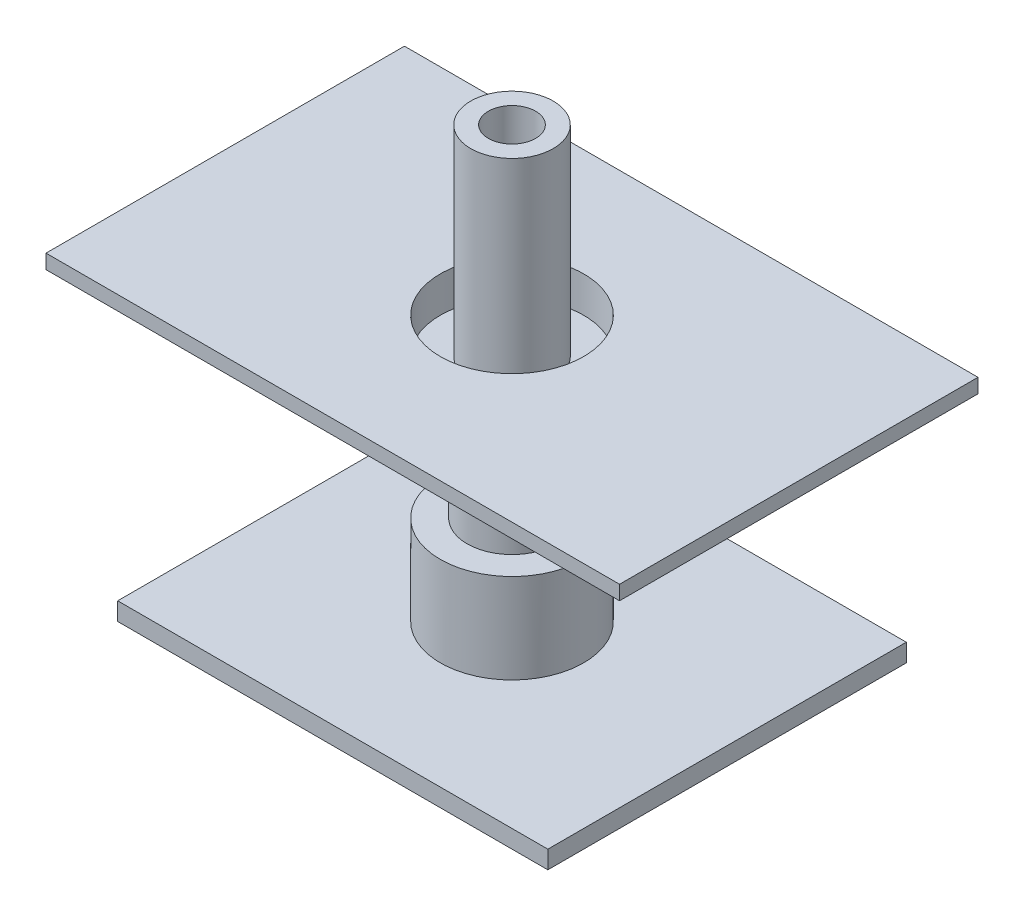
ISO-10303-21;
HEADER;
FILE_DESCRIPTION(('STEP AP214'),'2;1');
FILE_NAME('part.step','',(''),(''),'','','');
FILE_SCHEMA(('AUTOMOTIVE_DESIGN { 1 0 10303 214 1 1 1 1 }'));
ENDSEC;
DATA;
#1=APPLICATION_CONTEXT('core data for automotive mechanical design processes');
#2=APPLICATION_PROTOCOL_DEFINITION('international standard','automotive_design',2000,#1);
#3=PRODUCT_CONTEXT('',#1,'mechanical');
#4=PRODUCT('Part','Part','',(#3));
#5=PRODUCT_RELATED_PRODUCT_CATEGORY('part','',(#4));
#6=PRODUCT_DEFINITION_FORMATION('','',#4);
#7=PRODUCT_DEFINITION_CONTEXT('part definition',#1,'design');
#8=PRODUCT_DEFINITION('design','',#6,#7);
#9=PRODUCT_DEFINITION_SHAPE('','',#8);
#10=(LENGTH_UNIT() NAMED_UNIT(*) SI_UNIT(.MILLI.,.METRE.));
#11=(NAMED_UNIT(*) PLANE_ANGLE_UNIT() SI_UNIT($,.RADIAN.));
#12=(NAMED_UNIT(*) SI_UNIT($,.STERADIAN.) SOLID_ANGLE_UNIT());
#13=UNCERTAINTY_MEASURE_WITH_UNIT(LENGTH_MEASURE(1.E-05),#10,'distance_accuracy_value','');
#14=(GEOMETRIC_REPRESENTATION_CONTEXT(3) GLOBAL_UNCERTAINTY_ASSIGNED_CONTEXT((#13)) GLOBAL_UNIT_ASSIGNED_CONTEXT((#10,
#11,#12)) REPRESENTATION_CONTEXT('',''));
#15=CARTESIAN_POINT('',(0.,0.,0.));
#16=DIRECTION('',(0.,0.,1.));
#17=DIRECTION('',(1.,0.,0.));
#18=AXIS2_PLACEMENT_3D('',#15,#16,#17);
#19=CARTESIAN_POINT('',(0.,79.,0.));
#20=DIRECTION('',(0.,1.,0.));
#21=DIRECTION('',(0.,0.,1.));
#22=AXIS2_PLACEMENT_3D('',#19,#20,#21);
#23=PLANE('',#22);
#24=CARTESIAN_POINT('',(0.,79.,0.));
#25=DIRECTION('',(0.,1.,0.));
#26=DIRECTION('',(0.,0.,1.));
#27=AXIS2_PLACEMENT_3D('',#24,#25,#26);
#28=CIRCLE('',#27,20.);
#29=CARTESIAN_POINT('',(0.,79.,20.));
#30=VERTEX_POINT('',#29);
#31=EDGE_CURVE('E341',#30,#30,#28,.T.);
#32=ORIENTED_EDGE('',*,*,#31,.F.);
#33=EDGE_LOOP('',(#32));
#34=FACE_BOUND('',#33,.T.);
#35=DIRECTION('',(0.,0.,-1.));
#36=VECTOR('',#35,1.);
#37=CARTESIAN_POINT('',(80.,79.,50.));
#38=LINE('',#37,#36);
#39=CARTESIAN_POINT('',(80.,79.,50.));
#40=VERTEX_POINT('',#39);
#41=CARTESIAN_POINT('',(80.,79.,-50.));
#42=VERTEX_POINT('',#41);
#43=EDGE_CURVE('E99',#40,#42,#38,.T.);
#44=ORIENTED_EDGE('',*,*,#43,.T.);
#45=DIRECTION('',(-1.,0.,0.));
#46=VECTOR('',#45,1.);
#47=CARTESIAN_POINT('',(-80.,79.,-50.));
#48=LINE('',#47,#46);
#49=CARTESIAN_POINT('',(-80.,79.,-50.));
#50=VERTEX_POINT('',#49);
#51=EDGE_CURVE('E95',#42,#50,#48,.T.);
#52=ORIENTED_EDGE('',*,*,#51,.T.);
#53=DIRECTION('',(0.,0.,1.));
#54=VECTOR('',#53,1.);
#55=CARTESIAN_POINT('',(-80.,79.,50.));
#56=LINE('',#55,#54);
#57=CARTESIAN_POINT('',(-80.,79.,50.));
#58=VERTEX_POINT('',#57);
#59=EDGE_CURVE('E97',#50,#58,#56,.T.);
#60=ORIENTED_EDGE('',*,*,#59,.T.);
#61=DIRECTION('',(1.,0.,0.));
#62=VECTOR('',#61,1.);
#63=CARTESIAN_POINT('',(-80.,79.,50.));
#64=LINE('',#63,#62);
#65=EDGE_CURVE('E64',#58,#40,#64,.T.);
#66=ORIENTED_EDGE('',*,*,#65,.T.);
#67=EDGE_LOOP('',(#44,#52,#60,#66));
#68=FACE_BOUND('',#67,.T.);
#69=ADVANCED_FACE('F47',(#34,#68),#23,.T.);
#70=CARTESIAN_POINT('',(0.,75.,0.));
#71=DIRECTION('',(0.,-1.,0.));
#72=DIRECTION('',(0.,0.,-1.));
#73=AXIS2_PLACEMENT_3D('',#70,#71,#72);
#74=PLANE('',#73);
#75=CARTESIAN_POINT('',(0.,75.,0.));
#76=DIRECTION('',(0.,-1.,0.));
#77=DIRECTION('',(0.,0.,-1.));
#78=AXIS2_PLACEMENT_3D('',#75,#76,#77);
#79=CIRCLE('',#78,22.5);
#80=CARTESIAN_POINT('',(0.,75.,-22.5));
#81=VERTEX_POINT('',#80);
#82=EDGE_CURVE('E12',#81,#81,#79,.F.);
#83=ORIENTED_EDGE('',*,*,#82,.T.);
#84=EDGE_LOOP('',(#83));
#85=FACE_BOUND('',#84,.T.);
#86=DIRECTION('',(0.,0.,-1.));
#87=VECTOR('',#86,1.);
#88=CARTESIAN_POINT('',(80.,75.,50.));
#89=LINE('',#88,#87);
#90=CARTESIAN_POINT('',(80.,75.,50.));
#91=VERTEX_POINT('',#90);
#92=CARTESIAN_POINT('',(80.,75.,-50.));
#93=VERTEX_POINT('',#92);
#94=EDGE_CURVE('E114',#91,#93,#89,.T.);
#95=ORIENTED_EDGE('',*,*,#94,.F.);
#96=DIRECTION('',(1.,0.,0.));
#97=VECTOR('',#96,1.);
#98=CARTESIAN_POINT('',(-80.,75.,50.));
#99=LINE('',#98,#97);
#100=CARTESIAN_POINT('',(-80.,75.,50.));
#101=VERTEX_POINT('',#100);
#102=EDGE_CURVE('E87',#101,#91,#99,.T.);
#103=ORIENTED_EDGE('',*,*,#102,.F.);
#104=DIRECTION('',(0.,0.,1.));
#105=VECTOR('',#104,1.);
#106=CARTESIAN_POINT('',(-80.,75.,50.));
#107=LINE('',#106,#105);
#108=CARTESIAN_POINT('',(-80.,75.,-50.));
#109=VERTEX_POINT('',#108);
#110=EDGE_CURVE('E81',#109,#101,#107,.T.);
#111=ORIENTED_EDGE('',*,*,#110,.F.);
#112=DIRECTION('',(-1.,0.,0.));
#113=VECTOR('',#112,1.);
#114=CARTESIAN_POINT('',(-80.,75.,-50.));
#115=LINE('',#114,#113);
#116=EDGE_CURVE('E104',#93,#109,#115,.T.);
#117=ORIENTED_EDGE('',*,*,#116,.F.);
#118=EDGE_LOOP('',(#95,#103,#111,#117));
#119=FACE_BOUND('',#118,.T.);
#120=ADVANCED_FACE('F154',(#85,#119),#74,.T.);
#121=CARTESIAN_POINT('',(80.,79.,50.));
#122=DIRECTION('',(-1.,0.,0.));
#123=DIRECTION('',(0.,0.,1.));
#124=AXIS2_PLACEMENT_3D('',#121,#122,#123);
#125=PLANE('',#124);
#126=ORIENTED_EDGE('',*,*,#94,.T.);
#127=DIRECTION('',(0.,-1.,0.));
#128=VECTOR('',#127,1.);
#129=CARTESIAN_POINT('',(80.,79.,-50.));
#130=LINE('',#129,#128);
#131=EDGE_CURVE('E105',#42,#93,#130,.T.);
#132=ORIENTED_EDGE('',*,*,#131,.F.);
#133=ORIENTED_EDGE('',*,*,#43,.F.);
#134=DIRECTION('',(0.,-1.,0.));
#135=VECTOR('',#134,1.);
#136=CARTESIAN_POINT('',(80.,79.,50.));
#137=LINE('',#136,#135);
#138=EDGE_CURVE('E110',#40,#91,#137,.T.);
#139=ORIENTED_EDGE('',*,*,#138,.T.);
#140=EDGE_LOOP('',(#126,#132,#133,#139));
#141=FACE_BOUND('',#140,.T.);
#142=ADVANCED_FACE('F160',(#141),#125,.F.);
#143=CARTESIAN_POINT('',(-80.,79.,-50.));
#144=DIRECTION('',(0.,0.,1.));
#145=DIRECTION('',(1.,0.,0.));
#146=AXIS2_PLACEMENT_3D('',#143,#144,#145);
#147=PLANE('',#146);
#148=ORIENTED_EDGE('',*,*,#116,.T.);
#149=DIRECTION('',(0.,-1.,0.));
#150=VECTOR('',#149,1.);
#151=CARTESIAN_POINT('',(-80.,79.,-50.));
#152=LINE('',#151,#150);
#153=EDGE_CURVE('E102',#50,#109,#152,.T.);
#154=ORIENTED_EDGE('',*,*,#153,.F.);
#155=ORIENTED_EDGE('',*,*,#51,.F.);
#156=ORIENTED_EDGE('',*,*,#131,.T.);
#157=EDGE_LOOP('',(#148,#154,#155,#156));
#158=FACE_BOUND('',#157,.T.);
#159=ADVANCED_FACE('F103',(#158),#147,.F.);
#160=CARTESIAN_POINT('',(-80.,79.,50.));
#161=DIRECTION('',(1.,0.,0.));
#162=DIRECTION('',(0.,0.,-1.));
#163=AXIS2_PLACEMENT_3D('',#160,#161,#162);
#164=PLANE('',#163);
#165=ORIENTED_EDGE('',*,*,#110,.T.);
#166=DIRECTION('',(0.,-1.,0.));
#167=VECTOR('',#166,1.);
#168=CARTESIAN_POINT('',(-80.,79.,50.));
#169=LINE('',#168,#167);
#170=EDGE_CURVE('E106',#58,#101,#169,.T.);
#171=ORIENTED_EDGE('',*,*,#170,.F.);
#172=ORIENTED_EDGE('',*,*,#59,.F.);
#173=ORIENTED_EDGE('',*,*,#153,.T.);
#174=EDGE_LOOP('',(#165,#171,#172,#173));
#175=FACE_BOUND('',#174,.T.);
#176=ADVANCED_FACE('F108',(#175),#164,.F.);
#177=CARTESIAN_POINT('',(-80.,79.,50.));
#178=DIRECTION('',(0.,0.,-1.));
#179=DIRECTION('',(-1.,0.,0.));
#180=AXIS2_PLACEMENT_3D('',#177,#178,#179);
#181=PLANE('',#180);
#182=ORIENTED_EDGE('',*,*,#102,.T.);
#183=ORIENTED_EDGE('',*,*,#138,.F.);
#184=ORIENTED_EDGE('',*,*,#65,.F.);
#185=ORIENTED_EDGE('',*,*,#170,.T.);
#186=EDGE_LOOP('',(#182,#183,#184,#185));
#187=FACE_BOUND('',#186,.T.);
#188=ADVANCED_FACE('F144',(#187),#181,.F.);
#189=CARTESIAN_POINT('',(0.,5.,0.));
#190=DIRECTION('',(0.,1.,0.));
#191=DIRECTION('',(0.,0.,1.));
#192=AXIS2_PLACEMENT_3D('',#189,#190,#191);
#193=PLANE('',#192);
#194=CARTESIAN_POINT('',(0.,5.,0.));
#195=DIRECTION('',(0.,1.,0.));
#196=DIRECTION('',(0.,0.,1.));
#197=AXIS2_PLACEMENT_3D('',#194,#195,#196);
#198=CIRCLE('',#197,12.5);
#199=CARTESIAN_POINT('',(0.,5.,12.5));
#200=VERTEX_POINT('',#199);
#201=EDGE_CURVE('E136',#200,#200,#198,.T.);
#202=ORIENTED_EDGE('',*,*,#201,.F.);
#203=EDGE_LOOP('',(#202));
#204=FACE_BOUND('',#203,.T.);
#205=ADVANCED_FACE('F142',(#204),#193,.F.);
#206=CARTESIAN_POINT('',(0.,65.,0.));
#207=DIRECTION('',(0.,-1.,0.));
#208=DIRECTION('',(0.,0.,-1.));
#209=AXIS2_PLACEMENT_3D('',#206,#207,#208);
#210=CYLINDRICAL_SURFACE('',#209,12.5);
#211=CARTESIAN_POINT('',(0.,65.,0.));
#212=DIRECTION('',(0.,1.,0.));
#213=DIRECTION('',(0.,0.,1.));
#214=AXIS2_PLACEMENT_3D('',#211,#212,#213);
#215=CIRCLE('',#214,12.5);
#216=CARTESIAN_POINT('',(0.,65.,12.5));
#217=VERTEX_POINT('',#216);
#218=EDGE_CURVE('E56',#217,#217,#215,.T.);
#219=ORIENTED_EDGE('',*,*,#218,.F.);
#220=EDGE_LOOP('',(#219));
#221=FACE_BOUND('',#220,.T.);
#222=ORIENTED_EDGE('',*,*,#201,.T.);
#223=EDGE_LOOP('',(#222));
#224=FACE_BOUND('',#223,.T.);
#225=ADVANCED_FACE('F49',(#221,#224),#210,.T.);
#226=CARTESIAN_POINT('',(0.,65.,0.));
#227=DIRECTION('',(0.,1.,0.));
#228=DIRECTION('',(0.,0.,1.));
#229=AXIS2_PLACEMENT_3D('',#226,#227,#228);
#230=PLANE('',#229);
#231=CARTESIAN_POINT('',(0.,65.,0.));
#232=DIRECTION('',(0.,1.,0.));
#233=DIRECTION('',(0.,0.,1.));
#234=AXIS2_PLACEMENT_3D('',#231,#232,#233);
#235=CIRCLE('',#234,22.5);
#236=CARTESIAN_POINT('',(0.,65.,22.5));
#237=VERTEX_POINT('',#236);
#238=EDGE_CURVE('E124',#237,#237,#235,.F.);
#239=ORIENTED_EDGE('',*,*,#238,.T.);
#240=EDGE_LOOP('',(#239));
#241=FACE_BOUND('',#240,.T.);
#242=ORIENTED_EDGE('',*,*,#218,.T.);
#243=EDGE_LOOP('',(#242));
#244=FACE_BOUND('',#243,.T.);
#245=ADVANCED_FACE('F149',(#241,#244),#230,.F.);
#246=CARTESIAN_POINT('',(0.,1.36038969321071,0.));
#247=DIRECTION('',(0.,1.,0.));
#248=DIRECTION('',(0.,0.,1.));
#249=AXIS2_PLACEMENT_3D('',#246,#247,#248);
#250=CYLINDRICAL_SURFACE('',#249,22.5);
#251=ORIENTED_EDGE('',*,*,#82,.F.);
#252=EDGE_LOOP('',(#251));
#253=FACE_BOUND('',#252,.T.);
#254=ORIENTED_EDGE('',*,*,#238,.F.);
#255=EDGE_LOOP('',(#254));
#256=FACE_BOUND('',#255,.T.);
#257=ADVANCED_FACE('F167',(#253,#256),#250,.T.);
#258=CARTESIAN_POINT('',(0.,69.,0.));
#259=DIRECTION('',(0.,1.,0.));
#260=DIRECTION('',(0.,0.,1.));
#261=AXIS2_PLACEMENT_3D('',#258,#259,#260);
#262=CYLINDRICAL_SURFACE('',#261,20.);
#263=CARTESIAN_POINT('',(0.,69.,0.));
#264=DIRECTION('',(0.,1.,0.));
#265=DIRECTION('',(0.,0.,1.));
#266=AXIS2_PLACEMENT_3D('',#263,#264,#265);
#267=CIRCLE('',#266,20.);
#268=CARTESIAN_POINT('',(0.,69.,20.));
#269=VERTEX_POINT('',#268);
#270=EDGE_CURVE('E117',#269,#269,#267,.T.);
#271=ORIENTED_EDGE('',*,*,#270,.F.);
#272=EDGE_LOOP('',(#271));
#273=FACE_BOUND('',#272,.T.);
#274=ORIENTED_EDGE('',*,*,#31,.T.);
#275=EDGE_LOOP('',(#274));
#276=FACE_BOUND('',#275,.T.);
#277=ADVANCED_FACE('F170',(#273,#276),#262,.F.);
#278=CARTESIAN_POINT('',(0.,69.,0.));
#279=DIRECTION('',(0.,1.,0.));
#280=DIRECTION('',(0.,0.,1.));
#281=AXIS2_PLACEMENT_3D('',#278,#279,#280);
#282=PLANE('',#281);
#283=CARTESIAN_POINT('',(0.,69.,0.));
#284=DIRECTION('',(0.,1.,0.));
#285=DIRECTION('',(0.,0.,1.));
#286=AXIS2_PLACEMENT_3D('',#283,#284,#285);
#287=CIRCLE('',#286,11.5);
#288=CARTESIAN_POINT('',(0.,69.,11.5));
#289=VERTEX_POINT('',#288);
#290=EDGE_CURVE('E344',#289,#289,#287,.T.);
#291=ORIENTED_EDGE('',*,*,#290,.F.);
#292=EDGE_LOOP('',(#291));
#293=FACE_BOUND('',#292,.T.);
#294=ORIENTED_EDGE('',*,*,#270,.T.);
#295=EDGE_LOOP('',(#294));
#296=FACE_BOUND('',#295,.T.);
#297=ADVANCED_FACE('F183',(#293,#296),#282,.T.);
#298=CARTESIAN_POINT('',(0.,35.,0.));
#299=DIRECTION('',(0.,1.,0.));
#300=DIRECTION('',(0.,0.,1.));
#301=AXIS2_PLACEMENT_3D('',#298,#299,#300);
#302=PLANE('',#301);
#303=CARTESIAN_POINT('',(0.,35.,0.));
#304=DIRECTION('',(0.,1.,0.));
#305=DIRECTION('',(0.,0.,1.));
#306=AXIS2_PLACEMENT_3D('',#303,#304,#305);
#307=CIRCLE('',#306,6.58685547490694);
#308=CARTESIAN_POINT('',(0.,35.,6.58685547490694));
#309=VERTEX_POINT('',#308);
#310=EDGE_CURVE('E133',#309,#309,#307,.T.);
#311=ORIENTED_EDGE('',*,*,#310,.T.);
#312=EDGE_LOOP('',(#311));
#313=FACE_BOUND('',#312,.T.);
#314=ADVANCED_FACE('F181',(#313),#302,.T.);
#315=CARTESIAN_POINT('',(0.,35.,0.));
#316=DIRECTION('',(0.,1.,0.));
#317=DIRECTION('',(0.,0.,1.));
#318=AXIS2_PLACEMENT_3D('',#315,#316,#317);
#319=CYLINDRICAL_SURFACE('',#318,6.58685547490694);
#320=ORIENTED_EDGE('',*,*,#310,.F.);
#321=EDGE_LOOP('',(#320));
#322=FACE_BOUND('',#321,.T.);
#323=CARTESIAN_POINT('',(0.,125.,0.));
#324=DIRECTION('',(0.,1.,0.));
#325=DIRECTION('',(0.,0.,1.));
#326=AXIS2_PLACEMENT_3D('',#323,#324,#325);
#327=CIRCLE('',#326,6.58685547490694);
#328=CARTESIAN_POINT('',(0.,125.,6.58685547490694));
#329=VERTEX_POINT('',#328);
#330=EDGE_CURVE('E127',#329,#329,#327,.T.);
#331=ORIENTED_EDGE('',*,*,#330,.T.);
#332=EDGE_LOOP('',(#331));
#333=FACE_BOUND('',#332,.T.);
#334=ADVANCED_FACE('F176',(#322,#333),#319,.F.);
#335=CARTESIAN_POINT('',(0.,125.,0.));
#336=DIRECTION('',(0.,1.,0.));
#337=DIRECTION('',(0.,0.,1.));
#338=AXIS2_PLACEMENT_3D('',#335,#336,#337);
#339=PLANE('',#338);
#340=CARTESIAN_POINT('',(0.,125.,0.));
#341=DIRECTION('',(0.,1.,0.));
#342=DIRECTION('',(0.,0.,1.));
#343=AXIS2_PLACEMENT_3D('',#340,#341,#342);
#344=CIRCLE('',#343,11.5);
#345=CARTESIAN_POINT('',(0.,125.,11.5));
#346=VERTEX_POINT('',#345);
#347=EDGE_CURVE('E130',#346,#346,#344,.T.);
#348=ORIENTED_EDGE('',*,*,#347,.T.);
#349=EDGE_LOOP('',(#348));
#350=FACE_BOUND('',#349,.T.);
#351=ORIENTED_EDGE('',*,*,#330,.F.);
#352=EDGE_LOOP('',(#351));
#353=FACE_BOUND('',#352,.T.);
#354=ADVANCED_FACE('F172',(#350,#353),#339,.T.);
#355=CARTESIAN_POINT('',(0.,125.,0.));
#356=DIRECTION('',(0.,-1.,0.));
#357=DIRECTION('',(0.,0.,-1.));
#358=AXIS2_PLACEMENT_3D('',#355,#356,#357);
#359=CYLINDRICAL_SURFACE('',#358,11.5);
#360=ORIENTED_EDGE('',*,*,#347,.F.);
#361=EDGE_LOOP('',(#360));
#362=FACE_BOUND('',#361,.T.);
#363=ORIENTED_EDGE('',*,*,#290,.T.);
#364=EDGE_LOOP('',(#363));
#365=FACE_BOUND('',#364,.T.);
#366=ADVANCED_FACE('F175',(#362,#365),#359,.T.);
#367=CLOSED_SHELL('',(#69,#120,#142,#159,#176,#188,#205,#225,#245,#257,#277,#297,#314,#334,#354,#366));
#368=MANIFOLD_SOLID_BREP('B2',#367);
#369=CARTESIAN_POINT('',(60.,5.,50.));
#370=DIRECTION('',(-1.,0.,0.));
#371=DIRECTION('',(0.,0.,1.));
#372=AXIS2_PLACEMENT_3D('',#369,#370,#371);
#373=PLANE('',#372);
#374=DIRECTION('',(0.,0.,-1.));
#375=VECTOR('',#374,1.);
#376=CARTESIAN_POINT('',(60.,0.,50.));
#377=LINE('',#376,#375);
#378=CARTESIAN_POINT('',(60.,0.,50.));
#379=VERTEX_POINT('',#378);
#380=CARTESIAN_POINT('',(60.,0.,-50.));
#381=VERTEX_POINT('',#380);
#382=EDGE_CURVE('E428',#379,#381,#377,.T.);
#383=ORIENTED_EDGE('',*,*,#382,.T.);
#384=DIRECTION('',(0.,-1.,0.));
#385=VECTOR('',#384,1.);
#386=CARTESIAN_POINT('',(60.,5.,-50.));
#387=LINE('',#386,#385);
#388=CARTESIAN_POINT('',(60.,5.,-50.));
#389=VERTEX_POINT('',#388);
#390=EDGE_CURVE('E370',#389,#381,#387,.T.);
#391=ORIENTED_EDGE('',*,*,#390,.F.);
#392=DIRECTION('',(0.,0.,-1.));
#393=VECTOR('',#392,1.);
#394=CARTESIAN_POINT('',(60.,5.,50.));
#395=LINE('',#394,#393);
#396=CARTESIAN_POINT('',(60.,5.,50.));
#397=VERTEX_POINT('',#396);
#398=EDGE_CURVE('E414',#397,#389,#395,.T.);
#399=ORIENTED_EDGE('',*,*,#398,.F.);
#400=DIRECTION('',(0.,-1.,0.));
#401=VECTOR('',#400,1.);
#402=CARTESIAN_POINT('',(60.,5.,50.));
#403=LINE('',#402,#401);
#404=EDGE_CURVE('E424',#397,#379,#403,.T.);
#405=ORIENTED_EDGE('',*,*,#404,.T.);
#406=EDGE_LOOP('',(#383,#391,#399,#405));
#407=FACE_BOUND('',#406,.T.);
#408=ADVANCED_FACE('F362',(#407),#373,.F.);
#409=CARTESIAN_POINT('',(-60.,5.,-50.));
#410=DIRECTION('',(0.,0.,1.));
#411=DIRECTION('',(1.,0.,0.));
#412=AXIS2_PLACEMENT_3D('',#409,#410,#411);
#413=PLANE('',#412);
#414=DIRECTION('',(-1.,0.,0.));
#415=VECTOR('',#414,1.);
#416=CARTESIAN_POINT('',(-60.,0.,-50.));
#417=LINE('',#416,#415);
#418=CARTESIAN_POINT('',(-60.,0.,-50.));
#419=VERTEX_POINT('',#418);
#420=EDGE_CURVE('E419',#381,#419,#417,.T.);
#421=ORIENTED_EDGE('',*,*,#420,.T.);
#422=DIRECTION('',(0.,-1.,0.));
#423=VECTOR('',#422,1.);
#424=CARTESIAN_POINT('',(-60.,5.,-50.));
#425=LINE('',#424,#423);
#426=CARTESIAN_POINT('',(-60.,5.,-50.));
#427=VERTEX_POINT('',#426);
#428=EDGE_CURVE('E417',#427,#419,#425,.T.);
#429=ORIENTED_EDGE('',*,*,#428,.F.);
#430=DIRECTION('',(-1.,0.,0.));
#431=VECTOR('',#430,1.);
#432=CARTESIAN_POINT('',(-60.,5.,-50.));
#433=LINE('',#432,#431);
#434=EDGE_CURVE('E409',#389,#427,#433,.T.);
#435=ORIENTED_EDGE('',*,*,#434,.F.);
#436=ORIENTED_EDGE('',*,*,#390,.T.);
#437=EDGE_LOOP('',(#421,#429,#435,#436));
#438=FACE_BOUND('',#437,.T.);
#439=ADVANCED_FACE('F418',(#438),#413,.F.);
#440=CARTESIAN_POINT('',(-60.,5.,50.));
#441=DIRECTION('',(1.,0.,0.));
#442=DIRECTION('',(0.,0.,-1.));
#443=AXIS2_PLACEMENT_3D('',#440,#441,#442);
#444=PLANE('',#443);
#445=DIRECTION('',(0.,0.,1.));
#446=VECTOR('',#445,1.);
#447=CARTESIAN_POINT('',(-60.,0.,50.));
#448=LINE('',#447,#446);
#449=CARTESIAN_POINT('',(-60.,0.,50.));
#450=VERTEX_POINT('',#449);
#451=EDGE_CURVE('E395',#419,#450,#448,.T.);
#452=ORIENTED_EDGE('',*,*,#451,.T.);
#453=DIRECTION('',(0.,-1.,0.));
#454=VECTOR('',#453,1.);
#455=CARTESIAN_POINT('',(-60.,5.,50.));
#456=LINE('',#455,#454);
#457=CARTESIAN_POINT('',(-60.,5.,50.));
#458=VERTEX_POINT('',#457);
#459=EDGE_CURVE('E420',#458,#450,#456,.T.);
#460=ORIENTED_EDGE('',*,*,#459,.F.);
#461=DIRECTION('',(0.,0.,1.));
#462=VECTOR('',#461,1.);
#463=CARTESIAN_POINT('',(-60.,5.,50.));
#464=LINE('',#463,#462);
#465=EDGE_CURVE('E412',#427,#458,#464,.T.);
#466=ORIENTED_EDGE('',*,*,#465,.F.);
#467=ORIENTED_EDGE('',*,*,#428,.T.);
#468=EDGE_LOOP('',(#452,#460,#466,#467));
#469=FACE_BOUND('',#468,.T.);
#470=ADVANCED_FACE('F422',(#469),#444,.F.);
#471=CARTESIAN_POINT('',(-60.,5.,50.));
#472=DIRECTION('',(0.,0.,-1.));
#473=DIRECTION('',(-1.,0.,0.));
#474=AXIS2_PLACEMENT_3D('',#471,#472,#473);
#475=PLANE('',#474);
#476=DIRECTION('',(1.,0.,0.));
#477=VECTOR('',#476,1.);
#478=CARTESIAN_POINT('',(-60.,0.,50.));
#479=LINE('',#478,#477);
#480=EDGE_CURVE('E401',#450,#379,#479,.T.);
#481=ORIENTED_EDGE('',*,*,#480,.T.);
#482=ORIENTED_EDGE('',*,*,#404,.F.);
#483=DIRECTION('',(1.,0.,0.));
#484=VECTOR('',#483,1.);
#485=CARTESIAN_POINT('',(-60.,5.,50.));
#486=LINE('',#485,#484);
#487=EDGE_CURVE('E378',#458,#397,#486,.T.);
#488=ORIENTED_EDGE('',*,*,#487,.F.);
#489=ORIENTED_EDGE('',*,*,#459,.T.);
#490=EDGE_LOOP('',(#481,#482,#488,#489));
#491=FACE_BOUND('',#490,.T.);
#492=ADVANCED_FACE('F450',(#491),#475,.F.);
#493=CARTESIAN_POINT('',(0.,5.,0.));
#494=DIRECTION('',(0.,-1.,0.));
#495=DIRECTION('',(0.,0.,-1.));
#496=AXIS2_PLACEMENT_3D('',#493,#494,#495);
#497=PLANE('',#496);
#498=CARTESIAN_POINT('',(0.,5.,0.));
#499=DIRECTION('',(0.,-1.,0.));
#500=DIRECTION('',(0.,0.,-1.));
#501=AXIS2_PLACEMENT_3D('',#498,#499,#500);
#502=CIRCLE('',#501,20.);
#503=CARTESIAN_POINT('',(0.,5.,-20.));
#504=VERTEX_POINT('',#503);
#505=EDGE_CURVE('E45',#504,#504,#502,.F.);
#506=ORIENTED_EDGE('',*,*,#505,.F.);
#507=EDGE_LOOP('',(#506));
#508=FACE_BOUND('',#507,.T.);
#509=ORIENTED_EDGE('',*,*,#398,.T.);
#510=ORIENTED_EDGE('',*,*,#434,.T.);
#511=ORIENTED_EDGE('',*,*,#465,.T.);
#512=ORIENTED_EDGE('',*,*,#487,.T.);
#513=EDGE_LOOP('',(#509,#510,#511,#512));
#514=FACE_BOUND('',#513,.T.);
#515=ADVANCED_FACE('F410',(#508,#514),#497,.F.);
#516=CARTESIAN_POINT('',(0.,0.,0.));
#517=DIRECTION('',(0.,-1.,0.));
#518=DIRECTION('',(0.,0.,-1.));
#519=AXIS2_PLACEMENT_3D('',#516,#517,#518);
#520=PLANE('',#519);
#521=ORIENTED_EDGE('',*,*,#382,.F.);
#522=ORIENTED_EDGE('',*,*,#480,.F.);
#523=ORIENTED_EDGE('',*,*,#451,.F.);
#524=ORIENTED_EDGE('',*,*,#420,.F.);
#525=EDGE_LOOP('',(#521,#522,#523,#524));
#526=FACE_BOUND('',#525,.T.);
#527=ADVANCED_FACE('F439',(#526),#520,.T.);
#528=CARTESIAN_POINT('',(0.,30.,0.));
#529=DIRECTION('',(0.,1.,0.));
#530=DIRECTION('',(0.,0.,1.));
#531=AXIS2_PLACEMENT_3D('',#528,#529,#530);
#532=PLANE('',#531);
#533=CARTESIAN_POINT('',(0.,30.,0.));
#534=DIRECTION('',(0.,1.,0.));
#535=DIRECTION('',(0.,0.,1.));
#536=AXIS2_PLACEMENT_3D('',#533,#534,#535);
#537=CIRCLE('',#536,20.);
#538=CARTESIAN_POINT('',(0.,30.,20.));
#539=VERTEX_POINT('',#538);
#540=EDGE_CURVE('E431',#539,#539,#537,.T.);
#541=ORIENTED_EDGE('',*,*,#540,.T.);
#542=EDGE_LOOP('',(#541));
#543=FACE_BOUND('',#542,.T.);
#544=CARTESIAN_POINT('',(0.,30.,0.));
#545=DIRECTION('',(0.,1.,0.));
#546=DIRECTION('',(0.,0.,1.));
#547=AXIS2_PLACEMENT_3D('',#544,#545,#546);
#548=CIRCLE('',#547,12.5);
#549=CARTESIAN_POINT('',(0.,30.,12.5));
#550=VERTEX_POINT('',#549);
#551=EDGE_CURVE('E551',#550,#550,#548,.T.);
#552=ORIENTED_EDGE('',*,*,#551,.F.);
#553=EDGE_LOOP('',(#552));
#554=FACE_BOUND('',#553,.T.);
#555=ADVANCED_FACE('F441',(#543,#554),#532,.T.);
#556=CARTESIAN_POINT('',(0.,30.,0.));
#557=DIRECTION('',(0.,-1.,0.));
#558=DIRECTION('',(0.,0.,-1.));
#559=AXIS2_PLACEMENT_3D('',#556,#557,#558);
#560=CYLINDRICAL_SURFACE('',#559,20.);
#561=ORIENTED_EDGE('',*,*,#540,.F.);
#562=EDGE_LOOP('',(#561));
#563=FACE_BOUND('',#562,.T.);
#564=ORIENTED_EDGE('',*,*,#505,.T.);
#565=EDGE_LOOP('',(#564));
#566=FACE_BOUND('',#565,.T.);
#567=ADVANCED_FACE('F447',(#563,#566),#560,.T.);
#568=CARTESIAN_POINT('',(0.,30.,0.));
#569=DIRECTION('',(0.,-1.,0.));
#570=DIRECTION('',(0.,0.,-1.));
#571=AXIS2_PLACEMENT_3D('',#568,#569,#570);
#572=CYLINDRICAL_SURFACE('',#571,12.5);
#573=ORIENTED_EDGE('',*,*,#551,.T.);
#574=EDGE_LOOP('',(#573));
#575=FACE_BOUND('',#574,.T.);
#576=CARTESIAN_POINT('',(0.,5.,0.));
#577=DIRECTION('',(0.,1.,0.));
#578=DIRECTION('',(0.,0.,1.));
#579=AXIS2_PLACEMENT_3D('',#576,#577,#578);
#580=CIRCLE('',#579,12.5);
#581=CARTESIAN_POINT('',(0.,5.,12.5));
#582=VERTEX_POINT('',#581);
#583=EDGE_CURVE('E549',#582,#582,#580,.T.);
#584=ORIENTED_EDGE('',*,*,#583,.F.);
#585=EDGE_LOOP('',(#584));
#586=FACE_BOUND('',#585,.T.);
#587=ADVANCED_FACE('F492',(#575,#586),#572,.F.);
#588=ORIENTED_EDGE('',*,*,#583,.T.);
#589=EDGE_LOOP('',(#588));
#590=FACE_BOUND('',#589,.T.);
#591=ADVANCED_FACE('F453',(#590),#497,.F.);
#592=CLOSED_SHELL('',(#408,#439,#470,#492,#515,#527,#555,#567,#587,#591));
#593=MANIFOLD_SOLID_BREP('B6',#592);
#594=ADVANCED_BREP_SHAPE_REPRESENTATION('',(#18,#368,#593),#14);
#595=SHAPE_DEFINITION_REPRESENTATION(#9,#594);
ENDSEC;
END-ISO-10303-21;
